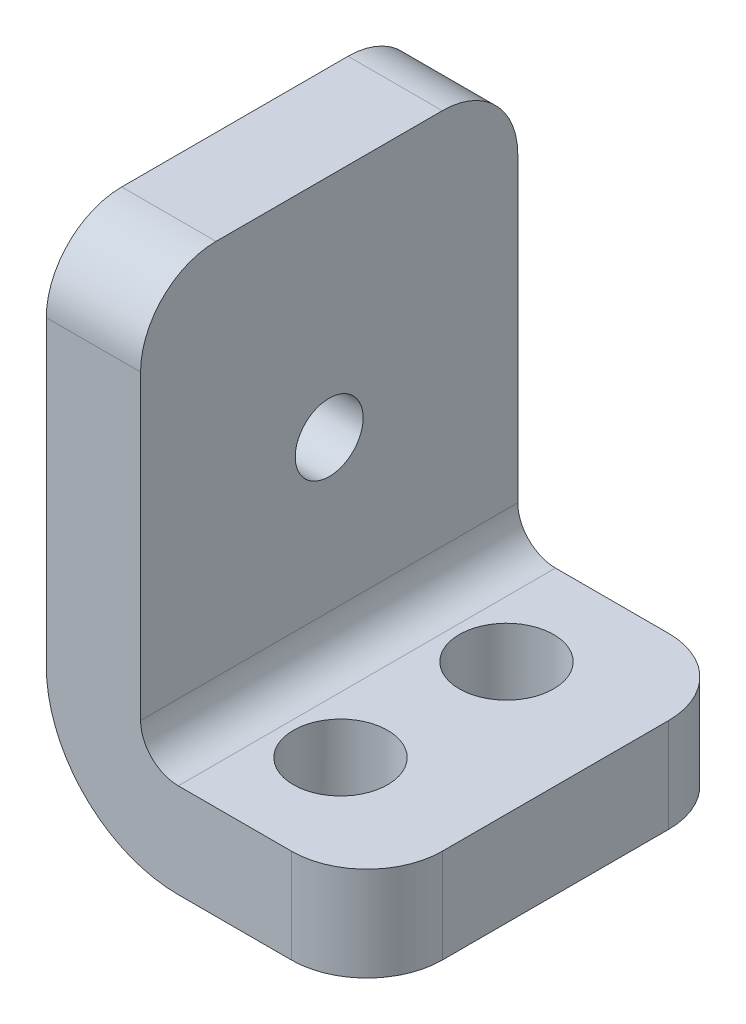
ISO-10303-21;
HEADER;
FILE_DESCRIPTION(('STEP AP214'),'2;1');
FILE_NAME('part.step','',(''),(''),'','','');
FILE_SCHEMA(('AUTOMOTIVE_DESIGN { 1 0 10303 214 1 1 1 1 }'));
ENDSEC;
DATA;
#1=APPLICATION_CONTEXT('core data for automotive mechanical design processes');
#2=APPLICATION_PROTOCOL_DEFINITION('international standard','automotive_design',2000,#1);
#3=PRODUCT_CONTEXT('',#1,'mechanical');
#4=PRODUCT('Part','Part','',(#3));
#5=PRODUCT_RELATED_PRODUCT_CATEGORY('part','',(#4));
#6=PRODUCT_DEFINITION_FORMATION('','',#4);
#7=PRODUCT_DEFINITION_CONTEXT('part definition',#1,'design');
#8=PRODUCT_DEFINITION('design','',#6,#7);
#9=PRODUCT_DEFINITION_SHAPE('','',#8);
#10=(LENGTH_UNIT() NAMED_UNIT(*) SI_UNIT(.MILLI.,.METRE.));
#11=(NAMED_UNIT(*) PLANE_ANGLE_UNIT() SI_UNIT($,.RADIAN.));
#12=(NAMED_UNIT(*) SI_UNIT($,.STERADIAN.) SOLID_ANGLE_UNIT());
#13=UNCERTAINTY_MEASURE_WITH_UNIT(LENGTH_MEASURE(1.E-05),#10,'distance_accuracy_value','');
#14=(GEOMETRIC_REPRESENTATION_CONTEXT(3) GLOBAL_UNCERTAINTY_ASSIGNED_CONTEXT((#13)) GLOBAL_UNIT_ASSIGNED_CONTEXT((#10,
#11,#12)) REPRESENTATION_CONTEXT('',''));
#15=CARTESIAN_POINT('',(0.,0.,0.));
#16=DIRECTION('',(0.,0.,1.));
#17=DIRECTION('',(1.,0.,0.));
#18=AXIS2_PLACEMENT_3D('',#15,#16,#17);
#19=CARTESIAN_POINT('',(-3.175,25.6907866234485,12.7));
#20=DIRECTION('',(0.,-1.,0.));
#21=DIRECTION('',(0.,0.,-1.));
#22=AXIS2_PLACEMENT_3D('',#19,#20,#21);
#23=PLANE('',#22);
#24=DIRECTION('',(0.,0.,-1.));
#25=VECTOR('',#24,1.);
#26=CARTESIAN_POINT('',(-3.175,25.6907866234485,12.7));
#27=LINE('',#26,#25);
#28=CARTESIAN_POINT('',(-3.175,25.6907866234485,10.16));
#29=VERTEX_POINT('',#28);
#30=CARTESIAN_POINT('',(-3.175,25.6907866234485,2.54));
#31=VERTEX_POINT('',#30);
#32=EDGE_CURVE('E159',#29,#31,#27,.T.);
#33=ORIENTED_EDGE('',*,*,#32,.F.);
#34=DIRECTION('',(-1.,0.,0.));
#35=VECTOR('',#34,1.);
#36=CARTESIAN_POINT('',(-3.175,25.6907866234485,10.16));
#37=LINE('',#36,#35);
#38=CARTESIAN_POINT('',(0.,25.6907866234485,10.16));
#39=VERTEX_POINT('',#38);
#40=EDGE_CURVE('E71',#29,#39,#37,.F.);
#41=ORIENTED_EDGE('',*,*,#40,.T.);
#42=DIRECTION('',(0.,0.,-1.));
#43=VECTOR('',#42,1.);
#44=CARTESIAN_POINT('',(0.,25.6907866234485,12.7));
#45=LINE('',#44,#43);
#46=CARTESIAN_POINT('',(0.,25.6907866234485,2.54));
#47=VERTEX_POINT('',#46);
#48=EDGE_CURVE('E176',#39,#47,#45,.T.);
#49=ORIENTED_EDGE('',*,*,#48,.T.);
#50=DIRECTION('',(-1.,0.,0.));
#51=VECTOR('',#50,1.);
#52=CARTESIAN_POINT('',(-3.175,25.6907866234485,2.54));
#53=LINE('',#52,#51);
#54=EDGE_CURVE('E230',#47,#31,#53,.T.);
#55=ORIENTED_EDGE('',*,*,#54,.T.);
#56=EDGE_LOOP('',(#33,#41,#49,#55));
#57=FACE_BOUND('',#56,.T.);
#58=ADVANCED_FACE('F50',(#57),#23,.F.);
#59=CARTESIAN_POINT('',(-3.175,25.6907866234485,12.7));
#60=DIRECTION('',(1.,0.,0.));
#61=DIRECTION('',(0.,1.,0.));
#62=AXIS2_PLACEMENT_3D('',#59,#60,#61);
#63=PLANE('',#62);
#64=CARTESIAN_POINT('',(-3.175,18.0707866234485,6.35));
#65=DIRECTION('',(1.,0.,0.));
#66=DIRECTION('',(0.,1.,0.));
#67=AXIS2_PLACEMENT_3D('',#64,#65,#66);
#68=CIRCLE('',#67,1.143);
#69=CARTESIAN_POINT('',(-3.175,18.0707866234485,5.207));
#70=VERTEX_POINT('',#69);
#71=EDGE_CURVE('E410',#70,#70,#68,.T.);
#72=ORIENTED_EDGE('',*,*,#71,.T.);
#73=EDGE_LOOP('',(#72));
#74=FACE_BOUND('',#73,.T.);
#75=DIRECTION('',(0.,-1.,0.));
#76=VECTOR('',#75,1.);
#77=CARTESIAN_POINT('',(-3.175,25.6907866234485,12.7));
#78=LINE('',#77,#76);
#79=CARTESIAN_POINT('',(-3.175,23.1507866234485,12.7));
#80=VERTEX_POINT('',#79);
#81=CARTESIAN_POINT('',(-3.175,12.9907866234485,12.7));
#82=VERTEX_POINT('',#81);
#83=EDGE_CURVE('E139',#80,#82,#78,.T.);
#84=ORIENTED_EDGE('',*,*,#83,.F.);
#85=CARTESIAN_POINT('',(-3.175,23.1507866234485,10.16));
#86=DIRECTION('',(1.,0.,0.));
#87=DIRECTION('',(0.,1.,0.));
#88=AXIS2_PLACEMENT_3D('',#85,#86,#87);
#89=CIRCLE('',#88,2.54);
#90=EDGE_CURVE('E228',#80,#29,#89,.F.);
#91=ORIENTED_EDGE('',*,*,#90,.T.);
#92=ORIENTED_EDGE('',*,*,#32,.T.);
#93=CARTESIAN_POINT('',(-3.175,23.1507866234485,2.54));
#94=DIRECTION('',(1.,0.,0.));
#95=DIRECTION('',(0.,1.,0.));
#96=AXIS2_PLACEMENT_3D('',#93,#94,#95);
#97=CIRCLE('',#96,2.54);
#98=CARTESIAN_POINT('',(-3.175,23.1507866234485,0.));
#99=VERTEX_POINT('',#98);
#100=EDGE_CURVE('E226',#31,#99,#97,.F.);
#101=ORIENTED_EDGE('',*,*,#100,.T.);
#102=DIRECTION('',(0.,-1.,0.));
#103=VECTOR('',#102,1.);
#104=CARTESIAN_POINT('',(-3.175,25.6907866234485,0.));
#105=LINE('',#104,#103);
#106=CARTESIAN_POINT('',(-3.175,12.9907866234485,0.));
#107=VERTEX_POINT('',#106);
#108=EDGE_CURVE('E156',#99,#107,#105,.T.);
#109=ORIENTED_EDGE('',*,*,#108,.T.);
#110=DIRECTION('',(0.,0.,-1.));
#111=VECTOR('',#110,1.);
#112=CARTESIAN_POINT('',(-3.175,12.9907866234485,12.7));
#113=LINE('',#112,#111);
#114=EDGE_CURVE('E153',#82,#107,#113,.T.);
#115=ORIENTED_EDGE('',*,*,#114,.F.);
#116=EDGE_LOOP('',(#84,#91,#92,#101,#109,#115));
#117=FACE_BOUND('',#116,.T.);
#118=ADVANCED_FACE('F154',(#74,#117),#63,.F.);
#119=CARTESIAN_POINT('',(1.27,12.9907866234485,12.7));
#120=DIRECTION('',(0.,0.,-1.));
#121=DIRECTION('',(-1.,0.,0.));
#122=AXIS2_PLACEMENT_3D('',#119,#120,#121);
#123=CYLINDRICAL_SURFACE('',#122,4.445);
#124=CARTESIAN_POINT('',(1.27,12.9907866234485,0.));
#125=DIRECTION('',(0.,0.,1.));
#126=DIRECTION('',(-1.,0.,0.));
#127=AXIS2_PLACEMENT_3D('',#124,#125,#126);
#128=CIRCLE('',#127,4.445);
#129=CARTESIAN_POINT('',(1.27,8.54578662344848,0.));
#130=VERTEX_POINT('',#129);
#131=EDGE_CURVE('E178',#107,#130,#128,.T.);
#132=ORIENTED_EDGE('',*,*,#131,.T.);
#133=DIRECTION('',(0.,0.,-1.));
#134=VECTOR('',#133,1.);
#135=CARTESIAN_POINT('',(1.27,8.54578662344848,12.7));
#136=LINE('',#135,#134);
#137=CARTESIAN_POINT('',(1.27,8.54578662344848,12.7));
#138=VERTEX_POINT('',#137);
#139=EDGE_CURVE('E160',#138,#130,#136,.T.);
#140=ORIENTED_EDGE('',*,*,#139,.F.);
#141=CARTESIAN_POINT('',(1.27,12.9907866234485,12.7));
#142=DIRECTION('',(0.,0.,1.));
#143=DIRECTION('',(-1.,0.,0.));
#144=AXIS2_PLACEMENT_3D('',#141,#142,#143);
#145=CIRCLE('',#144,4.445);
#146=EDGE_CURVE('E144',#82,#138,#145,.T.);
#147=ORIENTED_EDGE('',*,*,#146,.F.);
#148=ORIENTED_EDGE('',*,*,#114,.T.);
#149=EDGE_LOOP('',(#132,#140,#147,#148));
#150=FACE_BOUND('',#149,.T.);
#151=ADVANCED_FACE('F162',(#150),#123,.T.);
#152=CARTESIAN_POINT('',(1.27,8.54578662344848,12.7));
#153=DIRECTION('',(0.,1.,0.));
#154=DIRECTION('',(-1.,0.,0.));
#155=AXIS2_PLACEMENT_3D('',#152,#153,#154);
#156=PLANE('',#155);
#157=CARTESIAN_POINT('',(3.175,8.54578662344849,9.144));
#158=DIRECTION('',(0.,1.,0.));
#159=DIRECTION('',(-1.,0.,0.));
#160=AXIS2_PLACEMENT_3D('',#157,#158,#159);
#161=CIRCLE('',#160,1.5875);
#162=CARTESIAN_POINT('',(1.5875,8.54578662344848,9.144));
#163=VERTEX_POINT('',#162);
#164=EDGE_CURVE('E409',#163,#163,#161,.F.);
#165=ORIENTED_EDGE('',*,*,#164,.F.);
#166=EDGE_LOOP('',(#165));
#167=FACE_BOUND('',#166,.T.);
#168=CARTESIAN_POINT('',(3.175,8.54578662344849,3.556));
#169=DIRECTION('',(0.,1.,0.));
#170=DIRECTION('',(-1.,0.,0.));
#171=AXIS2_PLACEMENT_3D('',#168,#169,#170);
#172=CIRCLE('',#171,1.5875);
#173=CARTESIAN_POINT('',(1.5875,8.54578662344848,3.556));
#174=VERTEX_POINT('',#173);
#175=EDGE_CURVE('E413',#174,#174,#172,.F.);
#176=ORIENTED_EDGE('',*,*,#175,.F.);
#177=EDGE_LOOP('',(#176));
#178=FACE_BOUND('',#177,.T.);
#179=DIRECTION('',(0.,0.,-1.));
#180=VECTOR('',#179,1.);
#181=CARTESIAN_POINT('',(7.62,8.54578662344849,12.7));
#182=LINE('',#181,#180);
#183=CARTESIAN_POINT('',(7.62,8.54578662344849,10.16));
#184=VERTEX_POINT('',#183);
#185=CARTESIAN_POINT('',(7.62,8.54578662344849,2.54));
#186=VERTEX_POINT('',#185);
#187=EDGE_CURVE('E199',#184,#186,#182,.T.);
#188=ORIENTED_EDGE('',*,*,#187,.F.);
#189=CARTESIAN_POINT('',(5.08,8.54578662344849,10.16));
#190=DIRECTION('',(0.,1.,0.));
#191=DIRECTION('',(-1.,0.,0.));
#192=AXIS2_PLACEMENT_3D('',#189,#190,#191);
#193=CIRCLE('',#192,2.54);
#194=CARTESIAN_POINT('',(5.08,8.54578662344849,12.7));
#195=VERTEX_POINT('',#194);
#196=EDGE_CURVE('E220',#184,#195,#193,.F.);
#197=ORIENTED_EDGE('',*,*,#196,.T.);
#198=DIRECTION('',(1.,0.,0.));
#199=VECTOR('',#198,1.);
#200=CARTESIAN_POINT('',(1.27,8.54578662344848,12.7));
#201=LINE('',#200,#199);
#202=EDGE_CURVE('E165',#138,#195,#201,.T.);
#203=ORIENTED_EDGE('',*,*,#202,.F.);
#204=ORIENTED_EDGE('',*,*,#139,.T.);
#205=DIRECTION('',(1.,0.,0.));
#206=VECTOR('',#205,1.);
#207=CARTESIAN_POINT('',(1.27,8.54578662344848,0.));
#208=LINE('',#207,#206);
#209=CARTESIAN_POINT('',(5.08,8.54578662344849,0.));
#210=VERTEX_POINT('',#209);
#211=EDGE_CURVE('E181',#130,#210,#208,.T.);
#212=ORIENTED_EDGE('',*,*,#211,.T.);
#213=CARTESIAN_POINT('',(5.08,8.54578662344849,2.54));
#214=DIRECTION('',(0.,1.,0.));
#215=DIRECTION('',(-1.,0.,0.));
#216=AXIS2_PLACEMENT_3D('',#213,#214,#215);
#217=CIRCLE('',#216,2.54);
#218=EDGE_CURVE('E218',#210,#186,#217,.F.);
#219=ORIENTED_EDGE('',*,*,#218,.T.);
#220=EDGE_LOOP('',(#188,#197,#203,#204,#212,#219));
#221=FACE_BOUND('',#220,.T.);
#222=ADVANCED_FACE('F284',(#167,#178,#221),#156,.F.);
#223=CARTESIAN_POINT('',(7.62,11.7207866234485,12.7));
#224=DIRECTION('',(-1.,0.,0.));
#225=DIRECTION('',(0.,0.,1.));
#226=AXIS2_PLACEMENT_3D('',#223,#224,#225);
#227=PLANE('',#226);
#228=DIRECTION('',(0.,0.,-1.));
#229=VECTOR('',#228,1.);
#230=CARTESIAN_POINT('',(7.62,11.7207866234485,12.7));
#231=LINE('',#230,#229);
#232=CARTESIAN_POINT('',(7.62,11.7207866234485,10.16));
#233=VERTEX_POINT('',#232);
#234=CARTESIAN_POINT('',(7.62,11.7207866234485,2.54));
#235=VERTEX_POINT('',#234);
#236=EDGE_CURVE('E196',#233,#235,#231,.T.);
#237=ORIENTED_EDGE('',*,*,#236,.F.);
#238=DIRECTION('',(0.,1.,0.));
#239=VECTOR('',#238,1.);
#240=CARTESIAN_POINT('',(7.62,11.7207866234485,10.16));
#241=LINE('',#240,#239);
#242=EDGE_CURVE('E216',#233,#184,#241,.F.);
#243=ORIENTED_EDGE('',*,*,#242,.T.);
#244=ORIENTED_EDGE('',*,*,#187,.T.);
#245=DIRECTION('',(0.,1.,0.));
#246=VECTOR('',#245,1.);
#247=CARTESIAN_POINT('',(7.62,11.7207866234485,2.54));
#248=LINE('',#247,#246);
#249=EDGE_CURVE('E213',#186,#235,#248,.T.);
#250=ORIENTED_EDGE('',*,*,#249,.T.);
#251=EDGE_LOOP('',(#237,#243,#244,#250));
#252=FACE_BOUND('',#251,.T.);
#253=ADVANCED_FACE('F289',(#252),#227,.F.);
#254=CARTESIAN_POINT('',(1.27,11.7207866234485,12.7));
#255=DIRECTION('',(0.,-1.,0.));
#256=DIRECTION('',(0.,0.,-1.));
#257=AXIS2_PLACEMENT_3D('',#254,#255,#256);
#258=PLANE('',#257);
#259=CARTESIAN_POINT('',(3.175,11.7207866234485,9.144));
#260=DIRECTION('',(0.,1.,0.));
#261=DIRECTION('',(0.,0.,1.));
#262=AXIS2_PLACEMENT_3D('',#259,#260,#261);
#263=CIRCLE('',#262,1.5875);
#264=CARTESIAN_POINT('',(3.175,11.7207866234485,10.7315));
#265=VERTEX_POINT('',#264);
#266=EDGE_CURVE('E406',#265,#265,#263,.T.);
#267=ORIENTED_EDGE('',*,*,#266,.F.);
#268=EDGE_LOOP('',(#267));
#269=FACE_BOUND('',#268,.T.);
#270=CARTESIAN_POINT('',(3.175,11.7207866234485,3.556));
#271=DIRECTION('',(0.,1.,0.));
#272=DIRECTION('',(0.,0.,1.));
#273=AXIS2_PLACEMENT_3D('',#270,#271,#272);
#274=CIRCLE('',#273,1.5875);
#275=CARTESIAN_POINT('',(3.175,11.7207866234485,5.1435));
#276=VERTEX_POINT('',#275);
#277=EDGE_CURVE('E416',#276,#276,#274,.T.);
#278=ORIENTED_EDGE('',*,*,#277,.F.);
#279=EDGE_LOOP('',(#278));
#280=FACE_BOUND('',#279,.T.);
#281=DIRECTION('',(-1.,0.,0.));
#282=VECTOR('',#281,1.);
#283=CARTESIAN_POINT('',(1.27,11.7207866234485,12.7));
#284=LINE('',#283,#282);
#285=CARTESIAN_POINT('',(5.08,11.7207866234485,12.7));
#286=VERTEX_POINT('',#285);
#287=CARTESIAN_POINT('',(1.27,11.7207866234485,12.7));
#288=VERTEX_POINT('',#287);
#289=EDGE_CURVE('E167',#286,#288,#284,.T.);
#290=ORIENTED_EDGE('',*,*,#289,.F.);
#291=CARTESIAN_POINT('',(5.08,11.7207866234485,10.16));
#292=DIRECTION('',(0.,-1.,0.));
#293=DIRECTION('',(0.,0.,-1.));
#294=AXIS2_PLACEMENT_3D('',#291,#292,#293);
#295=CIRCLE('',#294,2.54);
#296=EDGE_CURVE('E211',#286,#233,#295,.F.);
#297=ORIENTED_EDGE('',*,*,#296,.T.);
#298=ORIENTED_EDGE('',*,*,#236,.T.);
#299=CARTESIAN_POINT('',(5.08,11.7207866234485,2.54));
#300=DIRECTION('',(0.,-1.,0.));
#301=DIRECTION('',(0.,0.,-1.));
#302=AXIS2_PLACEMENT_3D('',#299,#300,#301);
#303=CIRCLE('',#302,2.54);
#304=CARTESIAN_POINT('',(5.08,11.7207866234485,0.));
#305=VERTEX_POINT('',#304);
#306=EDGE_CURVE('E209',#235,#305,#303,.F.);
#307=ORIENTED_EDGE('',*,*,#306,.T.);
#308=DIRECTION('',(-1.,0.,0.));
#309=VECTOR('',#308,1.);
#310=CARTESIAN_POINT('',(1.27,11.7207866234485,0.));
#311=LINE('',#310,#309);
#312=CARTESIAN_POINT('',(1.27,11.7207866234485,0.));
#313=VERTEX_POINT('',#312);
#314=EDGE_CURVE('E184',#305,#313,#311,.T.);
#315=ORIENTED_EDGE('',*,*,#314,.T.);
#316=DIRECTION('',(0.,0.,-1.));
#317=VECTOR('',#316,1.);
#318=CARTESIAN_POINT('',(1.27,11.7207866234485,12.7));
#319=LINE('',#318,#317);
#320=EDGE_CURVE('E193',#288,#313,#319,.T.);
#321=ORIENTED_EDGE('',*,*,#320,.F.);
#322=EDGE_LOOP('',(#290,#297,#298,#307,#315,#321));
#323=FACE_BOUND('',#322,.T.);
#324=ADVANCED_FACE('F293',(#269,#280,#323),#258,.F.);
#325=CARTESIAN_POINT('',(1.27,12.9907866234485,12.7));
#326=DIRECTION('',(0.,0.,-1.));
#327=DIRECTION('',(-1.,0.,0.));
#328=AXIS2_PLACEMENT_3D('',#325,#326,#327);
#329=CYLINDRICAL_SURFACE('',#328,1.27);
#330=CARTESIAN_POINT('',(1.27,12.9907866234485,0.));
#331=DIRECTION('',(0.,0.,-1.));
#332=DIRECTION('',(-1.,0.,0.));
#333=AXIS2_PLACEMENT_3D('',#330,#331,#332);
#334=CIRCLE('',#333,1.27);
#335=CARTESIAN_POINT('',(0.,12.9907866234485,0.));
#336=VERTEX_POINT('',#335);
#337=EDGE_CURVE('E186',#313,#336,#334,.T.);
#338=ORIENTED_EDGE('',*,*,#337,.T.);
#339=DIRECTION('',(0.,0.,-1.));
#340=VECTOR('',#339,1.);
#341=CARTESIAN_POINT('',(0.,12.9907866234485,12.7));
#342=LINE('',#341,#340);
#343=CARTESIAN_POINT('',(0.,12.9907866234485,12.7));
#344=VERTEX_POINT('',#343);
#345=EDGE_CURVE('E190',#344,#336,#342,.T.);
#346=ORIENTED_EDGE('',*,*,#345,.F.);
#347=CARTESIAN_POINT('',(1.27,12.9907866234485,12.7));
#348=DIRECTION('',(0.,0.,-1.));
#349=DIRECTION('',(-1.,0.,0.));
#350=AXIS2_PLACEMENT_3D('',#347,#348,#349);
#351=CIRCLE('',#350,1.27);
#352=EDGE_CURVE('E172',#288,#344,#351,.T.);
#353=ORIENTED_EDGE('',*,*,#352,.F.);
#354=ORIENTED_EDGE('',*,*,#320,.T.);
#355=EDGE_LOOP('',(#338,#346,#353,#354));
#356=FACE_BOUND('',#355,.T.);
#357=ADVANCED_FACE('F245',(#356),#329,.F.);
#358=CARTESIAN_POINT('',(0.,25.6907866234485,12.7));
#359=DIRECTION('',(-1.,0.,0.));
#360=DIRECTION('',(0.,-1.,0.));
#361=AXIS2_PLACEMENT_3D('',#358,#359,#360);
#362=PLANE('',#361);
#363=CARTESIAN_POINT('',(0.,18.0707866234485,6.35));
#364=DIRECTION('',(-1.,0.,0.));
#365=DIRECTION('',(0.,-1.,0.));
#366=AXIS2_PLACEMENT_3D('',#363,#364,#365);
#367=CIRCLE('',#366,1.143);
#368=CARTESIAN_POINT('',(0.,18.0707866234485,5.207));
#369=VERTEX_POINT('',#368);
#370=EDGE_CURVE('E179',#369,#369,#367,.T.);
#371=ORIENTED_EDGE('',*,*,#370,.T.);
#372=EDGE_LOOP('',(#371));
#373=FACE_BOUND('',#372,.T.);
#374=ORIENTED_EDGE('',*,*,#48,.F.);
#375=CARTESIAN_POINT('',(0.,23.1507866234485,10.16));
#376=DIRECTION('',(-1.,0.,0.));
#377=DIRECTION('',(0.,-1.,0.));
#378=AXIS2_PLACEMENT_3D('',#375,#376,#377);
#379=CIRCLE('',#378,2.54);
#380=CARTESIAN_POINT('',(0.,23.1507866234485,12.7));
#381=VERTEX_POINT('',#380);
#382=EDGE_CURVE('E13',#39,#381,#379,.F.);
#383=ORIENTED_EDGE('',*,*,#382,.T.);
#384=DIRECTION('',(0.,1.,0.));
#385=VECTOR('',#384,1.);
#386=CARTESIAN_POINT('',(0.,25.6907866234485,12.7));
#387=LINE('',#386,#385);
#388=EDGE_CURVE('E174',#344,#381,#387,.T.);
#389=ORIENTED_EDGE('',*,*,#388,.F.);
#390=ORIENTED_EDGE('',*,*,#345,.T.);
#391=DIRECTION('',(0.,1.,0.));
#392=VECTOR('',#391,1.);
#393=CARTESIAN_POINT('',(0.,25.6907866234485,0.));
#394=LINE('',#393,#392);
#395=CARTESIAN_POINT('',(0.,23.1507866234485,0.));
#396=VERTEX_POINT('',#395);
#397=EDGE_CURVE('E150',#336,#396,#394,.T.);
#398=ORIENTED_EDGE('',*,*,#397,.T.);
#399=CARTESIAN_POINT('',(0.,23.1507866234485,2.54));
#400=DIRECTION('',(-1.,0.,0.));
#401=DIRECTION('',(0.,-1.,0.));
#402=AXIS2_PLACEMENT_3D('',#399,#400,#401);
#403=CIRCLE('',#402,2.54);
#404=EDGE_CURVE('E58',#396,#47,#403,.F.);
#405=ORIENTED_EDGE('',*,*,#404,.T.);
#406=EDGE_LOOP('',(#374,#383,#389,#390,#398,#405));
#407=FACE_BOUND('',#406,.T.);
#408=ADVANCED_FACE('F239',(#373,#407),#362,.F.);
#409=CARTESIAN_POINT('',(1.27,12.9907866234485,12.7));
#410=DIRECTION('',(0.,0.,-1.));
#411=DIRECTION('',(-1.,0.,0.));
#412=AXIS2_PLACEMENT_3D('',#409,#410,#411);
#413=PLANE('',#412);
#414=ORIENTED_EDGE('',*,*,#202,.T.);
#415=DIRECTION('',(0.,1.,0.));
#416=VECTOR('',#415,1.);
#417=CARTESIAN_POINT('',(5.08,12.9907866234485,12.7));
#418=LINE('',#417,#416);
#419=EDGE_CURVE('E206',#195,#286,#418,.T.);
#420=ORIENTED_EDGE('',*,*,#419,.T.);
#421=ORIENTED_EDGE('',*,*,#289,.T.);
#422=ORIENTED_EDGE('',*,*,#352,.T.);
#423=ORIENTED_EDGE('',*,*,#388,.T.);
#424=DIRECTION('',(-1.,0.,0.));
#425=VECTOR('',#424,1.);
#426=CARTESIAN_POINT('',(1.27,23.1507866234485,12.7));
#427=LINE('',#426,#425);
#428=EDGE_CURVE('E148',#381,#80,#427,.T.);
#429=ORIENTED_EDGE('',*,*,#428,.T.);
#430=ORIENTED_EDGE('',*,*,#83,.T.);
#431=ORIENTED_EDGE('',*,*,#146,.T.);
#432=EDGE_LOOP('',(#414,#420,#421,#422,#423,#429,#430,#431));
#433=FACE_BOUND('',#432,.T.);
#434=ADVANCED_FACE('F142',(#433),#413,.F.);
#435=CARTESIAN_POINT('',(1.27,12.9907866234485,0.));
#436=DIRECTION('',(0.,0.,-1.));
#437=DIRECTION('',(-1.,0.,0.));
#438=AXIS2_PLACEMENT_3D('',#435,#436,#437);
#439=PLANE('',#438);
#440=ORIENTED_EDGE('',*,*,#314,.F.);
#441=DIRECTION('',(0.,1.,0.));
#442=VECTOR('',#441,1.);
#443=CARTESIAN_POINT('',(5.08,8.54578662344849,0.));
#444=LINE('',#443,#442);
#445=EDGE_CURVE('E224',#305,#210,#444,.F.);
#446=ORIENTED_EDGE('',*,*,#445,.T.);
#447=ORIENTED_EDGE('',*,*,#211,.F.);
#448=ORIENTED_EDGE('',*,*,#131,.F.);
#449=ORIENTED_EDGE('',*,*,#108,.F.);
#450=DIRECTION('',(-1.,0.,0.));
#451=VECTOR('',#450,1.);
#452=CARTESIAN_POINT('',(0.,23.1507866234485,0.));
#453=LINE('',#452,#451);
#454=EDGE_CURVE('E222',#99,#396,#453,.F.);
#455=ORIENTED_EDGE('',*,*,#454,.T.);
#456=ORIENTED_EDGE('',*,*,#397,.F.);
#457=ORIENTED_EDGE('',*,*,#337,.F.);
#458=EDGE_LOOP('',(#440,#446,#447,#448,#449,#455,#456,#457));
#459=FACE_BOUND('',#458,.T.);
#460=ADVANCED_FACE('F250',(#459),#439,.T.);
#461=CARTESIAN_POINT('',(5.08,12.9907866234485,10.16));
#462=DIRECTION('',(0.,1.,0.));
#463=DIRECTION('',(0.,0.,1.));
#464=AXIS2_PLACEMENT_3D('',#461,#462,#463);
#465=CYLINDRICAL_SURFACE('',#464,2.54);
#466=ORIENTED_EDGE('',*,*,#196,.F.);
#467=ORIENTED_EDGE('',*,*,#242,.F.);
#468=ORIENTED_EDGE('',*,*,#296,.F.);
#469=ORIENTED_EDGE('',*,*,#419,.F.);
#470=EDGE_LOOP('',(#466,#467,#468,#469));
#471=FACE_BOUND('',#470,.T.);
#472=ADVANCED_FACE('F271',(#471),#465,.T.);
#473=CARTESIAN_POINT('',(5.08,11.7207866234485,2.54));
#474=DIRECTION('',(0.,-1.,0.));
#475=DIRECTION('',(0.,0.,-1.));
#476=AXIS2_PLACEMENT_3D('',#473,#474,#475);
#477=CYLINDRICAL_SURFACE('',#476,2.54);
#478=ORIENTED_EDGE('',*,*,#218,.F.);
#479=ORIENTED_EDGE('',*,*,#445,.F.);
#480=ORIENTED_EDGE('',*,*,#306,.F.);
#481=ORIENTED_EDGE('',*,*,#249,.F.);
#482=EDGE_LOOP('',(#478,#479,#480,#481));
#483=FACE_BOUND('',#482,.T.);
#484=ADVANCED_FACE('F261',(#483),#477,.T.);
#485=CARTESIAN_POINT('',(1.27,23.1507866234485,10.16));
#486=DIRECTION('',(-1.,0.,0.));
#487=DIRECTION('',(0.,0.,1.));
#488=AXIS2_PLACEMENT_3D('',#485,#486,#487);
#489=CYLINDRICAL_SURFACE('',#488,2.54);
#490=ORIENTED_EDGE('',*,*,#382,.F.);
#491=ORIENTED_EDGE('',*,*,#40,.F.);
#492=ORIENTED_EDGE('',*,*,#90,.F.);
#493=ORIENTED_EDGE('',*,*,#428,.F.);
#494=EDGE_LOOP('',(#490,#491,#492,#493));
#495=FACE_BOUND('',#494,.T.);
#496=ADVANCED_FACE('F237',(#495),#489,.T.);
#497=CARTESIAN_POINT('',(-3.175,23.1507866234485,2.54));
#498=DIRECTION('',(1.,0.,0.));
#499=DIRECTION('',(0.,0.,-1.));
#500=AXIS2_PLACEMENT_3D('',#497,#498,#499);
#501=CYLINDRICAL_SURFACE('',#500,2.54);
#502=ORIENTED_EDGE('',*,*,#404,.F.);
#503=ORIENTED_EDGE('',*,*,#454,.F.);
#504=ORIENTED_EDGE('',*,*,#100,.F.);
#505=ORIENTED_EDGE('',*,*,#54,.F.);
#506=EDGE_LOOP('',(#502,#503,#504,#505));
#507=FACE_BOUND('',#506,.T.);
#508=ADVANCED_FACE('F52',(#507),#501,.T.);
#509=CARTESIAN_POINT('',(-3.176,18.0707866234485,6.35));
#510=DIRECTION('',(1.,0.,0.));
#511=DIRECTION('',(0.,0.,-1.));
#512=AXIS2_PLACEMENT_3D('',#509,#510,#511);
#513=CYLINDRICAL_SURFACE('',#512,1.143);
#514=CARTESIAN_POINT('',(0.,18.0707866234485,5.207));
#515=CARTESIAN_POINT('',(-0.0330729166666671,18.0707866234485,5.207));
#516=CARTESIAN_POINT('',(-0.0661458333333337,18.0707866234485,5.207));
#517=CARTESIAN_POINT('',(-0.132291666666667,18.0707866234485,5.207));
#518=CARTESIAN_POINT('',(-0.165364583333334,18.0707866234485,5.207));
#519=CARTESIAN_POINT('',(-0.231510416666667,18.0707866234485,5.207));
#520=CARTESIAN_POINT('',(-0.264583333333334,18.0707866234485,5.207));
#521=CARTESIAN_POINT('',(-0.330729166666667,18.0707866234485,5.207));
#522=CARTESIAN_POINT('',(-0.363802083333333,18.0707866234485,5.207));
#523=CARTESIAN_POINT('',(-0.429947916666667,18.0707866234485,5.207));
#524=CARTESIAN_POINT('',(-0.463020833333334,18.0707866234485,5.207));
#525=CARTESIAN_POINT('',(-0.529166666666667,18.0707866234485,5.207));
#526=CARTESIAN_POINT('',(-0.562239583333334,18.0707866234485,5.207));
#527=CARTESIAN_POINT('',(-0.628385416666667,18.0707866234485,5.207));
#528=CARTESIAN_POINT('',(-0.661458333333334,18.0707866234485,5.207));
#529=CARTESIAN_POINT('',(-0.727604166666667,18.0707866234485,5.207));
#530=CARTESIAN_POINT('',(-0.760677083333334,18.0707866234485,5.207));
#531=CARTESIAN_POINT('',(-0.826822916666667,18.0707866234485,5.207));
#532=CARTESIAN_POINT('',(-0.859895833333334,18.0707866234485,5.207));
#533=CARTESIAN_POINT('',(-0.926041666666667,18.0707866234485,5.207));
#534=CARTESIAN_POINT('',(-0.959114583333333,18.0707866234485,5.207));
#535=CARTESIAN_POINT('',(-1.02526041666667,18.0707866234485,5.207));
#536=CARTESIAN_POINT('',(-1.05833333333333,18.0707866234485,5.207));
#537=CARTESIAN_POINT('',(-1.12447916666667,18.0707866234485,5.207));
#538=CARTESIAN_POINT('',(-1.15755208333333,18.0707866234485,5.207));
#539=CARTESIAN_POINT('',(-1.22369791666667,18.0707866234485,5.207));
#540=CARTESIAN_POINT('',(-1.25677083333333,18.0707866234485,5.207));
#541=CARTESIAN_POINT('',(-1.32291666666667,18.0707866234485,5.207));
#542=CARTESIAN_POINT('',(-1.35598958333333,18.0707866234485,5.207));
#543=CARTESIAN_POINT('',(-1.42213541666667,18.0707866234485,5.207));
#544=CARTESIAN_POINT('',(-1.45520833333333,18.0707866234485,5.207));
#545=CARTESIAN_POINT('',(-1.52135416666667,18.0707866234485,5.207));
#546=CARTESIAN_POINT('',(-1.55442708333333,18.0707866234485,5.207));
#547=CARTESIAN_POINT('',(-1.62057291666667,18.0707866234485,5.207));
#548=CARTESIAN_POINT('',(-1.65364583333333,18.0707866234485,5.207));
#549=CARTESIAN_POINT('',(-1.71979166666667,18.0707866234485,5.207));
#550=CARTESIAN_POINT('',(-1.75286458333333,18.0707866234485,5.207));
#551=CARTESIAN_POINT('',(-1.81901041666667,18.0707866234485,5.207));
#552=CARTESIAN_POINT('',(-1.85208333333333,18.0707866234485,5.207));
#553=CARTESIAN_POINT('',(-1.91822916666667,18.0707866234485,5.207));
#554=CARTESIAN_POINT('',(-1.95130208333333,18.0707866234485,5.207));
#555=CARTESIAN_POINT('',(-2.01744791666667,18.0707866234485,5.207));
#556=CARTESIAN_POINT('',(-2.05052083333333,18.0707866234485,5.207));
#557=CARTESIAN_POINT('',(-2.11666666666667,18.0707866234485,5.207));
#558=CARTESIAN_POINT('',(-2.14973958333333,18.0707866234485,5.207));
#559=CARTESIAN_POINT('',(-2.21588541666667,18.0707866234485,5.207));
#560=CARTESIAN_POINT('',(-2.24895833333333,18.0707866234485,5.207));
#561=CARTESIAN_POINT('',(-2.31510416666667,18.0707866234485,5.207));
#562=CARTESIAN_POINT('',(-2.34817708333333,18.0707866234485,5.207));
#563=CARTESIAN_POINT('',(-2.41432291666667,18.0707866234485,5.207));
#564=CARTESIAN_POINT('',(-2.44739583333333,18.0707866234485,5.207));
#565=CARTESIAN_POINT('',(-2.51354166666667,18.0707866234485,5.207));
#566=CARTESIAN_POINT('',(-2.54661458333333,18.0707866234485,5.207));
#567=CARTESIAN_POINT('',(-2.61276041666667,18.0707866234485,5.207));
#568=CARTESIAN_POINT('',(-2.64583333333333,18.0707866234485,5.207));
#569=CARTESIAN_POINT('',(-2.71197916666667,18.0707866234485,5.207));
#570=CARTESIAN_POINT('',(-2.74505208333333,18.0707866234485,5.207));
#571=CARTESIAN_POINT('',(-2.81119791666667,18.0707866234485,5.207));
#572=CARTESIAN_POINT('',(-2.84427083333333,18.0707866234485,5.207));
#573=CARTESIAN_POINT('',(-2.91041666666667,18.0707866234485,5.207));
#574=CARTESIAN_POINT('',(-2.94348958333333,18.0707866234485,5.207));
#575=CARTESIAN_POINT('',(-3.00963541666667,18.0707866234485,5.207));
#576=CARTESIAN_POINT('',(-3.04270833333333,18.0707866234485,5.207));
#577=CARTESIAN_POINT('',(-3.10885416666667,18.0707866234485,5.207));
#578=CARTESIAN_POINT('',(-3.14192708333333,18.0707866234485,5.207));
#579=CARTESIAN_POINT('',(-3.175,18.0707866234485,5.207));
#580=B_SPLINE_CURVE_WITH_KNOTS('',3,(#514,#515,#516,#517,#518,#519,#520,#521,#522,#523,#524,
#525,#526,#527,#528,#529,#530,#531,#532,#533,#534,#535,#536,#537,#538,#539,#540,#541,#542,#543,
#544,#545,#546,#547,#548,#549,#550,#551,#552,#553,#554,#555,#556,#557,#558,#559,#560,#561,#562,
#563,#564,#565,#566,#567,#568,#569,#570,#571,#572,#573,#574,#575,#576,#577,#578,#579),
.UNSPECIFIED.,.F.,.F.,(4,2,2,2,2,2,2,2,2,2,2,2,2,2,2,2,2,2,2,2,2,2,2,2,2,2,2,2,2,2,2,2,4),(0.,
0.0992187499999999,0.1984375,0.29765625,0.396875,0.49609375,0.5953125,0.69453125,0.79375,
0.89296875,0.9921875,1.09140625,1.190625,1.28984375,1.3890625,1.48828125,1.5875,1.68671875,
1.7859375,1.88515625,1.984375,2.08359375,2.1828125,2.28203125,2.38125,2.48046875,2.5796875,
2.67890625,2.778125,2.87734375,2.9765625,3.07578125,3.175),.UNSPECIFIED.);
#581=EDGE_CURVE('BSEAM253',#369,#70,#580,.T.);
#582=ORIENTED_EDGE('',*,*,#370,.F.);
#583=ORIENTED_EDGE('',*,*,#71,.F.);
#584=ORIENTED_EDGE('',*,*,#581,.T.);
#585=ORIENTED_EDGE('',*,*,#581,.F.);
#586=EDGE_LOOP('',(#582,#584,#583,#585));
#587=FACE_BOUND('',#586,.T.);
#588=ADVANCED_FACE('F253',(#587),#513,.F.);
#589=CARTESIAN_POINT('',(3.175,8.54478662344848,3.556));
#590=DIRECTION('',(0.,1.,0.));
#591=DIRECTION('',(0.,0.,1.));
#592=AXIS2_PLACEMENT_3D('',#589,#590,#591);
#593=CYLINDRICAL_SURFACE('',#592,1.5875);
#594=ORIENTED_EDGE('',*,*,#277,.T.);
#595=EDGE_LOOP('',(#594));
#596=FACE_BOUND('',#595,.T.);
#597=ORIENTED_EDGE('',*,*,#175,.T.);
#598=EDGE_LOOP('',(#597));
#599=FACE_BOUND('',#598,.T.);
#600=ADVANCED_FACE('F258',(#596,#599),#593,.F.);
#601=CARTESIAN_POINT('',(3.175,8.54478662344848,9.144));
#602=DIRECTION('',(0.,1.,0.));
#603=DIRECTION('',(0.,0.,1.));
#604=AXIS2_PLACEMENT_3D('',#601,#602,#603);
#605=CYLINDRICAL_SURFACE('',#604,1.5875);
#606=ORIENTED_EDGE('',*,*,#266,.T.);
#607=EDGE_LOOP('',(#606));
#608=FACE_BOUND('',#607,.T.);
#609=ORIENTED_EDGE('',*,*,#164,.T.);
#610=EDGE_LOOP('',(#609));
#611=FACE_BOUND('',#610,.T.);
#612=ADVANCED_FACE('F390',(#608,#611),#605,.F.);
#613=CLOSED_SHELL('',(#58,#118,#151,#222,#253,#324,#357,#408,#434,#460,#472,#484,#496,#508,#588,
#600,#612));
#614=MANIFOLD_SOLID_BREP('B2',#613);
#615=ADVANCED_BREP_SHAPE_REPRESENTATION('',(#18,#614),#14);
#616=SHAPE_DEFINITION_REPRESENTATION(#9,#615);
ENDSEC;
END-ISO-10303-21;
